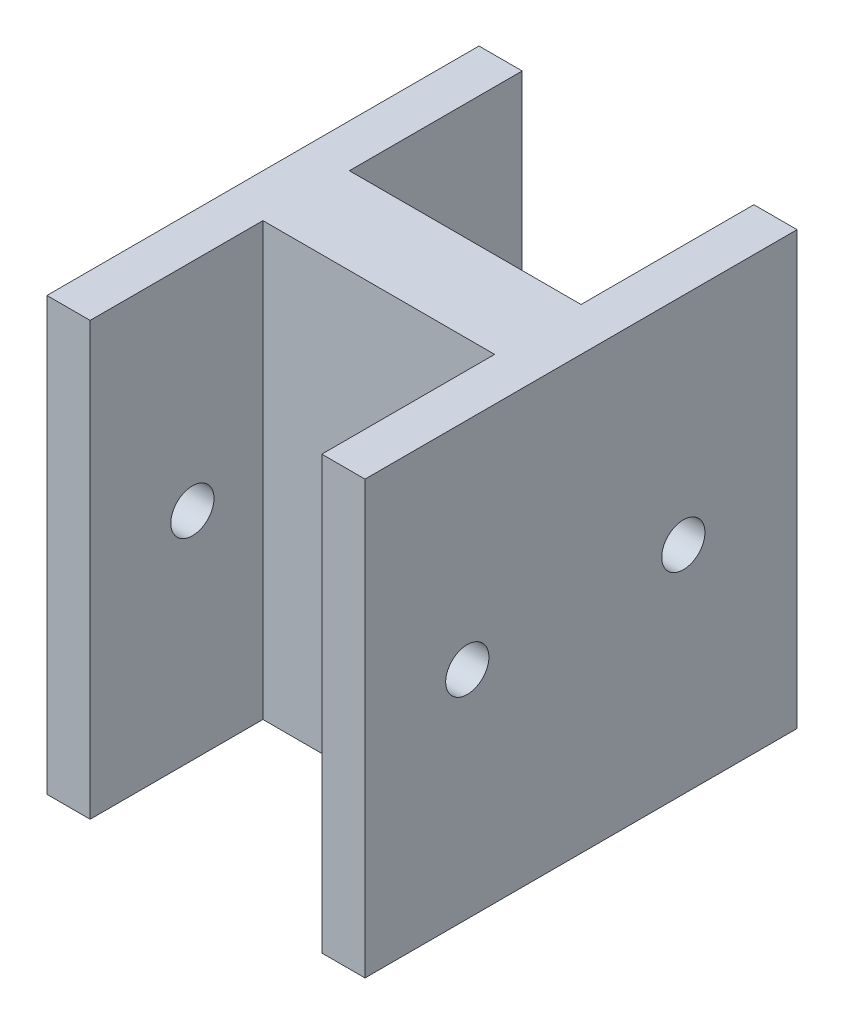
ISO-10303-21;
HEADER;
FILE_DESCRIPTION(('STEP AP214'),'2;1');
FILE_NAME('part.step','',(''),(''),'','','');
FILE_SCHEMA(('AUTOMOTIVE_DESIGN { 1 0 10303 214 1 1 1 1 }'));
ENDSEC;
DATA;
#1=APPLICATION_CONTEXT('core data for automotive mechanical design processes');
#2=APPLICATION_PROTOCOL_DEFINITION('international standard','automotive_design',2000,#1);
#3=PRODUCT_CONTEXT('',#1,'mechanical');
#4=PRODUCT('Part','Part','',(#3));
#5=PRODUCT_RELATED_PRODUCT_CATEGORY('part','',(#4));
#6=PRODUCT_DEFINITION_FORMATION('','',#4);
#7=PRODUCT_DEFINITION_CONTEXT('part definition',#1,'design');
#8=PRODUCT_DEFINITION('design','',#6,#7);
#9=PRODUCT_DEFINITION_SHAPE('','',#8);
#10=(LENGTH_UNIT() NAMED_UNIT(*) SI_UNIT(.MILLI.,.METRE.));
#11=(NAMED_UNIT(*) PLANE_ANGLE_UNIT() SI_UNIT($,.RADIAN.));
#12=(NAMED_UNIT(*) SI_UNIT($,.STERADIAN.) SOLID_ANGLE_UNIT());
#13=UNCERTAINTY_MEASURE_WITH_UNIT(LENGTH_MEASURE(1.E-05),#10,'distance_accuracy_value','');
#14=(GEOMETRIC_REPRESENTATION_CONTEXT(3) GLOBAL_UNCERTAINTY_ASSIGNED_CONTEXT((#13)) GLOBAL_UNIT_ASSIGNED_CONTEXT((#10,
#11,#12)) REPRESENTATION_CONTEXT('',''));
#15=CARTESIAN_POINT('',(0.,0.,0.));
#16=DIRECTION('',(0.,0.,1.));
#17=DIRECTION('',(1.,0.,0.));
#18=AXIS2_PLACEMENT_3D('',#15,#16,#17);
#19=CARTESIAN_POINT('',(-11.3188405797101,10.,-7.6328502415459));
#20=DIRECTION('',(0.,0.,1.));
#21=DIRECTION('',(1.,0.,0.));
#22=AXIS2_PLACEMENT_3D('',#19,#20,#21);
#23=PLANE('',#22);
#24=DIRECTION('',(-1.,0.,0.));
#25=VECTOR('',#24,1.);
#26=CARTESIAN_POINT('',(-11.3188405797101,0.,-7.6328502415459));
#27=LINE('',#26,#25);
#28=CARTESIAN_POINT('',(-11.3188405797101,0.,-7.6328502415459));
#29=VERTEX_POINT('',#28);
#30=CARTESIAN_POINT('',(-12.3188405797101,0.,-7.6328502415459));
#31=VERTEX_POINT('',#30);
#32=EDGE_CURVE('E165',#29,#31,#27,.T.);
#33=ORIENTED_EDGE('',*,*,#32,.T.);
#34=DIRECTION('',(0.,-1.,0.));
#35=VECTOR('',#34,1.);
#36=CARTESIAN_POINT('',(-12.3188405797101,10.,-7.6328502415459));
#37=LINE('',#36,#35);
#38=CARTESIAN_POINT('',(-12.3188405797101,10.,-7.6328502415459));
#39=VERTEX_POINT('',#38);
#40=EDGE_CURVE('E11',#39,#31,#37,.T.);
#41=ORIENTED_EDGE('',*,*,#40,.F.);
#42=DIRECTION('',(-1.,0.,0.));
#43=VECTOR('',#42,1.);
#44=CARTESIAN_POINT('',(-11.3188405797101,10.,-7.6328502415459));
#45=LINE('',#44,#43);
#46=CARTESIAN_POINT('',(-11.3188405797101,10.,-7.6328502415459));
#47=VERTEX_POINT('',#46);
#48=EDGE_CURVE('E200',#47,#39,#45,.T.);
#49=ORIENTED_EDGE('',*,*,#48,.F.);
#50=DIRECTION('',(0.,-1.,0.));
#51=VECTOR('',#50,1.);
#52=CARTESIAN_POINT('',(-11.3188405797101,10.,-7.6328502415459));
#53=LINE('',#52,#51);
#54=EDGE_CURVE('E161',#47,#29,#53,.T.);
#55=ORIENTED_EDGE('',*,*,#54,.T.);
#56=EDGE_LOOP('',(#33,#41,#49,#55));
#57=FACE_BOUND('',#56,.T.);
#58=ADVANCED_FACE('F39',(#57),#23,.F.);
#59=CARTESIAN_POINT('',(-12.3188405797101,10.,-7.6328502415459));
#60=DIRECTION('',(1.,0.,0.));
#61=DIRECTION('',(0.,0.,-1.));
#62=AXIS2_PLACEMENT_3D('',#59,#60,#61);
#63=PLANE('',#62);
#64=CARTESIAN_POINT('',(-12.3188405797101,5.,-5.));
#65=DIRECTION('',(1.,0.,0.));
#66=DIRECTION('',(0.,0.,-1.));
#67=AXIS2_PLACEMENT_3D('',#64,#65,#66);
#68=CIRCLE('',#67,0.5);
#69=CARTESIAN_POINT('',(-12.3188405797101,5.,-5.5));
#70=VERTEX_POINT('',#69);
#71=EDGE_CURVE('E343',#70,#70,#68,.T.);
#72=ORIENTED_EDGE('',*,*,#71,.T.);
#73=EDGE_LOOP('',(#72));
#74=FACE_BOUND('',#73,.T.);
#75=CARTESIAN_POINT('',(-12.3188405797101,5.,0.));
#76=DIRECTION('',(1.,0.,0.));
#77=DIRECTION('',(0.,0.,-1.));
#78=AXIS2_PLACEMENT_3D('',#75,#76,#77);
#79=CIRCLE('',#78,0.5);
#80=CARTESIAN_POINT('',(-12.3188405797101,5.,-0.5));
#81=VERTEX_POINT('',#80);
#82=EDGE_CURVE('E341',#81,#81,#79,.T.);
#83=ORIENTED_EDGE('',*,*,#82,.T.);
#84=EDGE_LOOP('',(#83));
#85=FACE_BOUND('',#84,.T.);
#86=DIRECTION('',(0.,0.,1.));
#87=VECTOR('',#86,1.);
#88=CARTESIAN_POINT('',(-12.3188405797101,0.,-7.6328502415459));
#89=LINE('',#88,#87);
#90=CARTESIAN_POINT('',(-12.3188405797101,0.,2.3671497584541));
#91=VERTEX_POINT('',#90);
#92=EDGE_CURVE('E169',#31,#91,#89,.T.);
#93=ORIENTED_EDGE('',*,*,#92,.T.);
#94=DIRECTION('',(0.,-1.,0.));
#95=VECTOR('',#94,1.);
#96=CARTESIAN_POINT('',(-12.3188405797101,10.,2.3671497584541));
#97=LINE('',#96,#95);
#98=CARTESIAN_POINT('',(-12.3188405797101,10.,2.3671497584541));
#99=VERTEX_POINT('',#98);
#100=EDGE_CURVE('E49',#99,#91,#97,.T.);
#101=ORIENTED_EDGE('',*,*,#100,.F.);
#102=DIRECTION('',(0.,0.,1.));
#103=VECTOR('',#102,1.);
#104=CARTESIAN_POINT('',(-12.3188405797101,10.,-7.6328502415459));
#105=LINE('',#104,#103);
#106=EDGE_CURVE('E112',#39,#99,#105,.T.);
#107=ORIENTED_EDGE('',*,*,#106,.F.);
#108=ORIENTED_EDGE('',*,*,#40,.T.);
#109=EDGE_LOOP('',(#93,#101,#107,#108));
#110=FACE_BOUND('',#109,.T.);
#111=ADVANCED_FACE('F297',(#74,#85,#110),#63,.F.);
#112=CARTESIAN_POINT('',(-12.3188405797101,10.,2.3671497584541));
#113=DIRECTION('',(0.,0.,-1.));
#114=DIRECTION('',(-1.,0.,0.));
#115=AXIS2_PLACEMENT_3D('',#112,#113,#114);
#116=PLANE('',#115);
#117=DIRECTION('',(1.,0.,0.));
#118=VECTOR('',#117,1.);
#119=CARTESIAN_POINT('',(-12.3188405797101,0.,2.3671497584541));
#120=LINE('',#119,#118);
#121=CARTESIAN_POINT('',(-11.3188405797101,0.,2.3671497584541));
#122=VERTEX_POINT('',#121);
#123=EDGE_CURVE('E173',#91,#122,#120,.T.);
#124=ORIENTED_EDGE('',*,*,#123,.T.);
#125=DIRECTION('',(0.,-1.,0.));
#126=VECTOR('',#125,1.);
#127=CARTESIAN_POINT('',(-11.3188405797101,10.,2.3671497584541));
#128=LINE('',#127,#126);
#129=CARTESIAN_POINT('',(-11.3188405797101,10.,2.3671497584541));
#130=VERTEX_POINT('',#129);
#131=EDGE_CURVE('E227',#130,#122,#128,.T.);
#132=ORIENTED_EDGE('',*,*,#131,.F.);
#133=DIRECTION('',(1.,0.,0.));
#134=VECTOR('',#133,1.);
#135=CARTESIAN_POINT('',(-12.3188405797101,10.,2.3671497584541));
#136=LINE('',#135,#134);
#137=EDGE_CURVE('E238',#99,#130,#136,.T.);
#138=ORIENTED_EDGE('',*,*,#137,.F.);
#139=ORIENTED_EDGE('',*,*,#100,.T.);
#140=EDGE_LOOP('',(#124,#132,#138,#139));
#141=FACE_BOUND('',#140,.T.);
#142=ADVANCED_FACE('F236',(#141),#116,.F.);
#143=CARTESIAN_POINT('',(-11.3188405797101,10.,2.3671497584541));
#144=DIRECTION('',(-1.,0.,0.));
#145=DIRECTION('',(0.,0.,1.));
#146=AXIS2_PLACEMENT_3D('',#143,#144,#145);
#147=PLANE('',#146);
#148=CARTESIAN_POINT('',(-11.3188405797101,5.,0.));
#149=DIRECTION('',(-1.,0.,0.));
#150=DIRECTION('',(0.,0.,1.));
#151=AXIS2_PLACEMENT_3D('',#148,#149,#150);
#152=CIRCLE('',#151,0.5);
#153=CARTESIAN_POINT('',(-11.3188405797101,5.,0.5));
#154=VERTEX_POINT('',#153);
#155=EDGE_CURVE('E170',#154,#154,#152,.T.);
#156=ORIENTED_EDGE('',*,*,#155,.T.);
#157=EDGE_LOOP('',(#156));
#158=FACE_BOUND('',#157,.T.);
#159=DIRECTION('',(0.,0.,-1.));
#160=VECTOR('',#159,1.);
#161=CARTESIAN_POINT('',(-11.3188405797101,0.,2.3671497584541));
#162=LINE('',#161,#160);
#163=CARTESIAN_POINT('',(-11.3188405797101,0.,-1.6328502415459));
#164=VERTEX_POINT('',#163);
#165=EDGE_CURVE('E176',#122,#164,#162,.T.);
#166=ORIENTED_EDGE('',*,*,#165,.T.);
#167=DIRECTION('',(0.,-1.,0.));
#168=VECTOR('',#167,1.);
#169=CARTESIAN_POINT('',(-11.3188405797101,10.,-1.6328502415459));
#170=LINE('',#169,#168);
#171=CARTESIAN_POINT('',(-11.3188405797101,10.,-1.6328502415459));
#172=VERTEX_POINT('',#171);
#173=EDGE_CURVE('E223',#172,#164,#170,.T.);
#174=ORIENTED_EDGE('',*,*,#173,.F.);
#175=DIRECTION('',(0.,0.,-1.));
#176=VECTOR('',#175,1.);
#177=CARTESIAN_POINT('',(-11.3188405797101,10.,2.3671497584541));
#178=LINE('',#177,#176);
#179=EDGE_CURVE('E257',#130,#172,#178,.T.);
#180=ORIENTED_EDGE('',*,*,#179,.F.);
#181=ORIENTED_EDGE('',*,*,#131,.T.);
#182=EDGE_LOOP('',(#166,#174,#180,#181));
#183=FACE_BOUND('',#182,.T.);
#184=ADVANCED_FACE('F247',(#158,#183),#147,.F.);
#185=CARTESIAN_POINT('',(-11.3188405797101,10.,-1.6328502415459));
#186=DIRECTION('',(0.,0.,-1.));
#187=DIRECTION('',(-1.,0.,0.));
#188=AXIS2_PLACEMENT_3D('',#185,#186,#187);
#189=PLANE('',#188);
#190=DIRECTION('',(1.,0.,0.));
#191=VECTOR('',#190,1.);
#192=CARTESIAN_POINT('',(-11.3188405797101,0.,-1.6328502415459));
#193=LINE('',#192,#191);
#194=CARTESIAN_POINT('',(-5.95652173913044,0.,-1.6328502415459));
#195=VERTEX_POINT('',#194);
#196=EDGE_CURVE('E179',#164,#195,#193,.T.);
#197=ORIENTED_EDGE('',*,*,#196,.T.);
#198=DIRECTION('',(0.,-1.,0.));
#199=VECTOR('',#198,1.);
#200=CARTESIAN_POINT('',(-5.95652173913044,10.,-1.6328502415459));
#201=LINE('',#200,#199);
#202=CARTESIAN_POINT('',(-5.95652173913044,10.,-1.6328502415459));
#203=VERTEX_POINT('',#202);
#204=EDGE_CURVE('E219',#203,#195,#201,.T.);
#205=ORIENTED_EDGE('',*,*,#204,.F.);
#206=DIRECTION('',(1.,0.,0.));
#207=VECTOR('',#206,1.);
#208=CARTESIAN_POINT('',(-11.3188405797101,10.,-1.6328502415459));
#209=LINE('',#208,#207);
#210=EDGE_CURVE('E253',#172,#203,#209,.T.);
#211=ORIENTED_EDGE('',*,*,#210,.F.);
#212=ORIENTED_EDGE('',*,*,#173,.T.);
#213=EDGE_LOOP('',(#197,#205,#211,#212));
#214=FACE_BOUND('',#213,.T.);
#215=ADVANCED_FACE('F251',(#214),#189,.F.);
#216=CARTESIAN_POINT('',(-5.95652173913044,10.,-1.6328502415459));
#217=DIRECTION('',(1.,0.,0.));
#218=DIRECTION('',(0.,0.,-1.));
#219=AXIS2_PLACEMENT_3D('',#216,#217,#218);
#220=PLANE('',#219);
#221=CARTESIAN_POINT('',(-5.95652173913043,5.,0.));
#222=DIRECTION('',(1.,0.,0.));
#223=DIRECTION('',(0.,0.,-1.));
#224=AXIS2_PLACEMENT_3D('',#221,#222,#223);
#225=CIRCLE('',#224,0.5);
#226=CARTESIAN_POINT('',(-5.95652173913043,5.,-0.5));
#227=VERTEX_POINT('',#226);
#228=EDGE_CURVE('E350',#227,#227,#225,.T.);
#229=ORIENTED_EDGE('',*,*,#228,.T.);
#230=EDGE_LOOP('',(#229));
#231=FACE_BOUND('',#230,.T.);
#232=DIRECTION('',(0.,0.,1.));
#233=VECTOR('',#232,1.);
#234=CARTESIAN_POINT('',(-5.95652173913044,0.,-1.6328502415459));
#235=LINE('',#234,#233);
#236=CARTESIAN_POINT('',(-5.95652173913043,0.,2.3671497584541));
#237=VERTEX_POINT('',#236);
#238=EDGE_CURVE('E182',#195,#237,#235,.T.);
#239=ORIENTED_EDGE('',*,*,#238,.T.);
#240=DIRECTION('',(0.,-1.,0.));
#241=VECTOR('',#240,1.);
#242=CARTESIAN_POINT('',(-5.95652173913043,10.,2.3671497584541));
#243=LINE('',#242,#241);
#244=CARTESIAN_POINT('',(-5.95652173913043,10.,2.3671497584541));
#245=VERTEX_POINT('',#244);
#246=EDGE_CURVE('E215',#245,#237,#243,.T.);
#247=ORIENTED_EDGE('',*,*,#246,.F.);
#248=DIRECTION('',(0.,0.,1.));
#249=VECTOR('',#248,1.);
#250=CARTESIAN_POINT('',(-5.95652173913044,10.,-1.6328502415459));
#251=LINE('',#250,#249);
#252=EDGE_CURVE('E256',#203,#245,#251,.T.);
#253=ORIENTED_EDGE('',*,*,#252,.F.);
#254=ORIENTED_EDGE('',*,*,#204,.T.);
#255=EDGE_LOOP('',(#239,#247,#253,#254));
#256=FACE_BOUND('',#255,.T.);
#257=ADVANCED_FACE('F314',(#231,#256),#220,.F.);
#258=CARTESIAN_POINT('',(-5.95652173913043,10.,2.3671497584541));
#259=DIRECTION('',(0.,0.,-1.));
#260=DIRECTION('',(-1.,0.,0.));
#261=AXIS2_PLACEMENT_3D('',#258,#259,#260);
#262=PLANE('',#261);
#263=DIRECTION('',(1.,0.,0.));
#264=VECTOR('',#263,1.);
#265=CARTESIAN_POINT('',(-5.95652173913043,0.,2.3671497584541));
#266=LINE('',#265,#264);
#267=CARTESIAN_POINT('',(-4.95652173913043,0.,2.3671497584541));
#268=VERTEX_POINT('',#267);
#269=EDGE_CURVE('E185',#237,#268,#266,.T.);
#270=ORIENTED_EDGE('',*,*,#269,.T.);
#271=DIRECTION('',(0.,-1.,0.));
#272=VECTOR('',#271,1.);
#273=CARTESIAN_POINT('',(-4.95652173913043,10.,2.3671497584541));
#274=LINE('',#273,#272);
#275=CARTESIAN_POINT('',(-4.95652173913043,10.,2.3671497584541));
#276=VERTEX_POINT('',#275);
#277=EDGE_CURVE('E211',#276,#268,#274,.T.);
#278=ORIENTED_EDGE('',*,*,#277,.F.);
#279=DIRECTION('',(1.,0.,0.));
#280=VECTOR('',#279,1.);
#281=CARTESIAN_POINT('',(-5.95652173913043,10.,2.3671497584541));
#282=LINE('',#281,#280);
#283=EDGE_CURVE('E261',#245,#276,#282,.T.);
#284=ORIENTED_EDGE('',*,*,#283,.F.);
#285=ORIENTED_EDGE('',*,*,#246,.T.);
#286=EDGE_LOOP('',(#270,#278,#284,#285));
#287=FACE_BOUND('',#286,.T.);
#288=ADVANCED_FACE('F317',(#287),#262,.F.);
#289=CARTESIAN_POINT('',(-4.95652173913043,10.,2.3671497584541));
#290=DIRECTION('',(-1.,0.,0.));
#291=DIRECTION('',(0.,0.,1.));
#292=AXIS2_PLACEMENT_3D('',#289,#290,#291);
#293=PLANE('',#292);
#294=CARTESIAN_POINT('',(-4.95652173913043,5.,-5.));
#295=DIRECTION('',(1.,0.,0.));
#296=DIRECTION('',(0.,0.,-1.));
#297=AXIS2_PLACEMENT_3D('',#294,#295,#296);
#298=CIRCLE('',#297,0.5);
#299=CARTESIAN_POINT('',(-4.95652173913043,5.,-5.5));
#300=VERTEX_POINT('',#299);
#301=EDGE_CURVE('E346',#300,#300,#298,.T.);
#302=ORIENTED_EDGE('',*,*,#301,.F.);
#303=EDGE_LOOP('',(#302));
#304=FACE_BOUND('',#303,.T.);
#305=CARTESIAN_POINT('',(-4.95652173913043,5.,0.));
#306=DIRECTION('',(1.,0.,0.));
#307=DIRECTION('',(0.,0.,-1.));
#308=AXIS2_PLACEMENT_3D('',#305,#306,#307);
#309=CIRCLE('',#308,0.5);
#310=CARTESIAN_POINT('',(-4.95652173913043,5.,-0.5));
#311=VERTEX_POINT('',#310);
#312=EDGE_CURVE('E336',#311,#311,#309,.T.);
#313=ORIENTED_EDGE('',*,*,#312,.F.);
#314=EDGE_LOOP('',(#313));
#315=FACE_BOUND('',#314,.T.);
#316=DIRECTION('',(0.,0.,-1.));
#317=VECTOR('',#316,1.);
#318=CARTESIAN_POINT('',(-4.95652173913043,0.,2.3671497584541));
#319=LINE('',#318,#317);
#320=CARTESIAN_POINT('',(-4.95652173913043,0.,-7.6328502415459));
#321=VERTEX_POINT('',#320);
#322=EDGE_CURVE('E188',#268,#321,#319,.T.);
#323=ORIENTED_EDGE('',*,*,#322,.T.);
#324=DIRECTION('',(0.,-1.,0.));
#325=VECTOR('',#324,1.);
#326=CARTESIAN_POINT('',(-4.95652173913043,10.,-7.6328502415459));
#327=LINE('',#326,#325);
#328=CARTESIAN_POINT('',(-4.95652173913043,10.,-7.6328502415459));
#329=VERTEX_POINT('',#328);
#330=EDGE_CURVE('E207',#329,#321,#327,.T.);
#331=ORIENTED_EDGE('',*,*,#330,.F.);
#332=DIRECTION('',(0.,0.,-1.));
#333=VECTOR('',#332,1.);
#334=CARTESIAN_POINT('',(-4.95652173913043,10.,2.3671497584541));
#335=LINE('',#334,#333);
#336=EDGE_CURVE('E268',#276,#329,#335,.T.);
#337=ORIENTED_EDGE('',*,*,#336,.F.);
#338=ORIENTED_EDGE('',*,*,#277,.T.);
#339=EDGE_LOOP('',(#323,#331,#337,#338));
#340=FACE_BOUND('',#339,.T.);
#341=ADVANCED_FACE('F276',(#304,#315,#340),#293,.F.);
#342=CARTESIAN_POINT('',(-4.95652173913043,10.,-7.6328502415459));
#343=DIRECTION('',(0.,0.,1.));
#344=DIRECTION('',(1.,0.,0.));
#345=AXIS2_PLACEMENT_3D('',#342,#343,#344);
#346=PLANE('',#345);
#347=DIRECTION('',(-1.,0.,0.));
#348=VECTOR('',#347,1.);
#349=CARTESIAN_POINT('',(-4.95652173913043,0.,-7.6328502415459));
#350=LINE('',#349,#348);
#351=CARTESIAN_POINT('',(-5.95652173913044,0.,-7.6328502415459));
#352=VERTEX_POINT('',#351);
#353=EDGE_CURVE('E191',#321,#352,#350,.T.);
#354=ORIENTED_EDGE('',*,*,#353,.T.);
#355=DIRECTION('',(0.,-1.,0.));
#356=VECTOR('',#355,1.);
#357=CARTESIAN_POINT('',(-5.95652173913044,10.,-7.6328502415459));
#358=LINE('',#357,#356);
#359=CARTESIAN_POINT('',(-5.95652173913044,10.,-7.6328502415459));
#360=VERTEX_POINT('',#359);
#361=EDGE_CURVE('E154',#360,#352,#358,.T.);
#362=ORIENTED_EDGE('',*,*,#361,.F.);
#363=DIRECTION('',(-1.,0.,0.));
#364=VECTOR('',#363,1.);
#365=CARTESIAN_POINT('',(-4.95652173913043,10.,-7.6328502415459));
#366=LINE('',#365,#364);
#367=EDGE_CURVE('E143',#329,#360,#366,.T.);
#368=ORIENTED_EDGE('',*,*,#367,.F.);
#369=ORIENTED_EDGE('',*,*,#330,.T.);
#370=EDGE_LOOP('',(#354,#362,#368,#369));
#371=FACE_BOUND('',#370,.T.);
#372=ADVANCED_FACE('F280',(#371),#346,.F.);
#373=CARTESIAN_POINT('',(-5.95652173913044,10.,-7.6328502415459));
#374=DIRECTION('',(1.,0.,0.));
#375=DIRECTION('',(0.,0.,-1.));
#376=AXIS2_PLACEMENT_3D('',#373,#374,#375);
#377=PLANE('',#376);
#378=CARTESIAN_POINT('',(-5.95652173913043,5.,-5.));
#379=DIRECTION('',(1.,0.,0.));
#380=DIRECTION('',(0.,0.,-1.));
#381=AXIS2_PLACEMENT_3D('',#378,#379,#380);
#382=CIRCLE('',#381,0.5);
#383=CARTESIAN_POINT('',(-5.95652173913043,5.,-5.5));
#384=VERTEX_POINT('',#383);
#385=EDGE_CURVE('E333',#384,#384,#382,.T.);
#386=ORIENTED_EDGE('',*,*,#385,.T.);
#387=EDGE_LOOP('',(#386));
#388=FACE_BOUND('',#387,.T.);
#389=DIRECTION('',(0.,0.,1.));
#390=VECTOR('',#389,1.);
#391=CARTESIAN_POINT('',(-5.95652173913044,0.,-7.6328502415459));
#392=LINE('',#391,#390);
#393=CARTESIAN_POINT('',(-5.95652173913043,0.,-3.6328502415459));
#394=VERTEX_POINT('',#393);
#395=EDGE_CURVE('E152',#352,#394,#392,.T.);
#396=ORIENTED_EDGE('',*,*,#395,.T.);
#397=DIRECTION('',(0.,-1.,0.));
#398=VECTOR('',#397,1.);
#399=CARTESIAN_POINT('',(-5.95652173913043,10.,-3.6328502415459));
#400=LINE('',#399,#398);
#401=CARTESIAN_POINT('',(-5.95652173913043,10.,-3.6328502415459));
#402=VERTEX_POINT('',#401);
#403=EDGE_CURVE('E149',#402,#394,#400,.T.);
#404=ORIENTED_EDGE('',*,*,#403,.F.);
#405=DIRECTION('',(0.,0.,1.));
#406=VECTOR('',#405,1.);
#407=CARTESIAN_POINT('',(-5.95652173913044,10.,-7.6328502415459));
#408=LINE('',#407,#406);
#409=EDGE_CURVE('E137',#360,#402,#408,.T.);
#410=ORIENTED_EDGE('',*,*,#409,.F.);
#411=ORIENTED_EDGE('',*,*,#361,.T.);
#412=EDGE_LOOP('',(#396,#404,#410,#411));
#413=FACE_BOUND('',#412,.T.);
#414=ADVANCED_FACE('F150',(#388,#413),#377,.F.);
#415=CARTESIAN_POINT('',(-5.95652173913043,10.,-3.6328502415459));
#416=DIRECTION('',(0.,0.,1.));
#417=DIRECTION('',(1.,0.,0.));
#418=AXIS2_PLACEMENT_3D('',#415,#416,#417);
#419=PLANE('',#418);
#420=DIRECTION('',(-1.,0.,0.));
#421=VECTOR('',#420,1.);
#422=CARTESIAN_POINT('',(-5.95652173913043,0.,-3.6328502415459));
#423=LINE('',#422,#421);
#424=CARTESIAN_POINT('',(-11.3188405797101,0.,-3.6328502415459));
#425=VERTEX_POINT('',#424);
#426=EDGE_CURVE('E98',#394,#425,#423,.T.);
#427=ORIENTED_EDGE('',*,*,#426,.T.);
#428=DIRECTION('',(0.,-1.,0.));
#429=VECTOR('',#428,1.);
#430=CARTESIAN_POINT('',(-11.3188405797101,10.,-3.6328502415459));
#431=LINE('',#430,#429);
#432=CARTESIAN_POINT('',(-11.3188405797101,10.,-3.6328502415459));
#433=VERTEX_POINT('',#432);
#434=EDGE_CURVE('E155',#433,#425,#431,.T.);
#435=ORIENTED_EDGE('',*,*,#434,.F.);
#436=DIRECTION('',(-1.,0.,0.));
#437=VECTOR('',#436,1.);
#438=CARTESIAN_POINT('',(-5.95652173913043,10.,-3.6328502415459));
#439=LINE('',#438,#437);
#440=EDGE_CURVE('E141',#402,#433,#439,.T.);
#441=ORIENTED_EDGE('',*,*,#440,.F.);
#442=ORIENTED_EDGE('',*,*,#403,.T.);
#443=EDGE_LOOP('',(#427,#435,#441,#442));
#444=FACE_BOUND('',#443,.T.);
#445=ADVANCED_FACE('F157',(#444),#419,.F.);
#446=CARTESIAN_POINT('',(-11.3188405797101,10.,-3.6328502415459));
#447=DIRECTION('',(-1.,0.,0.));
#448=DIRECTION('',(0.,0.,1.));
#449=AXIS2_PLACEMENT_3D('',#446,#447,#448);
#450=PLANE('',#449);
#451=CARTESIAN_POINT('',(-11.3188405797101,5.,-5.));
#452=DIRECTION('',(-1.,0.,0.));
#453=DIRECTION('',(0.,0.,1.));
#454=AXIS2_PLACEMENT_3D('',#451,#452,#453);
#455=CIRCLE('',#454,0.5);
#456=CARTESIAN_POINT('',(-11.3188405797101,5.,-4.5));
#457=VERTEX_POINT('',#456);
#458=EDGE_CURVE('E42',#457,#457,#455,.T.);
#459=ORIENTED_EDGE('',*,*,#458,.T.);
#460=EDGE_LOOP('',(#459));
#461=FACE_BOUND('',#460,.T.);
#462=DIRECTION('',(0.,0.,-1.));
#463=VECTOR('',#462,1.);
#464=CARTESIAN_POINT('',(-11.3188405797101,0.,-3.6328502415459));
#465=LINE('',#464,#463);
#466=EDGE_CURVE('E104',#425,#29,#465,.T.);
#467=ORIENTED_EDGE('',*,*,#466,.T.);
#468=ORIENTED_EDGE('',*,*,#54,.F.);
#469=DIRECTION('',(0.,0.,-1.));
#470=VECTOR('',#469,1.);
#471=CARTESIAN_POINT('',(-11.3188405797101,10.,-3.6328502415459));
#472=LINE('',#471,#470);
#473=EDGE_CURVE('E57',#433,#47,#472,.T.);
#474=ORIENTED_EDGE('',*,*,#473,.F.);
#475=ORIENTED_EDGE('',*,*,#434,.T.);
#476=EDGE_LOOP('',(#467,#468,#474,#475));
#477=FACE_BOUND('',#476,.T.);
#478=ADVANCED_FACE('F284',(#461,#477),#450,.F.);
#479=CARTESIAN_POINT('',(0.,10.,0.));
#480=DIRECTION('',(0.,1.,0.));
#481=DIRECTION('',(0.,0.,1.));
#482=AXIS2_PLACEMENT_3D('',#479,#480,#481);
#483=PLANE('',#482);
#484=ORIENTED_EDGE('',*,*,#48,.T.);
#485=ORIENTED_EDGE('',*,*,#106,.T.);
#486=ORIENTED_EDGE('',*,*,#137,.T.);
#487=ORIENTED_EDGE('',*,*,#179,.T.);
#488=ORIENTED_EDGE('',*,*,#210,.T.);
#489=ORIENTED_EDGE('',*,*,#252,.T.);
#490=ORIENTED_EDGE('',*,*,#283,.T.);
#491=ORIENTED_EDGE('',*,*,#336,.T.);
#492=ORIENTED_EDGE('',*,*,#367,.T.);
#493=ORIENTED_EDGE('',*,*,#409,.T.);
#494=ORIENTED_EDGE('',*,*,#440,.T.);
#495=ORIENTED_EDGE('',*,*,#473,.T.);
#496=EDGE_LOOP('',(#484,#485,#486,#487,#488,#489,#490,#491,#492,#493,#494,#495));
#497=FACE_BOUND('',#496,.T.);
#498=ADVANCED_FACE('F139',(#497),#483,.T.);
#499=CARTESIAN_POINT('',(0.,0.,0.));
#500=DIRECTION('',(0.,1.,0.));
#501=DIRECTION('',(0.,0.,1.));
#502=AXIS2_PLACEMENT_3D('',#499,#500,#501);
#503=PLANE('',#502);
#504=ORIENTED_EDGE('',*,*,#32,.F.);
#505=ORIENTED_EDGE('',*,*,#466,.F.);
#506=ORIENTED_EDGE('',*,*,#426,.F.);
#507=ORIENTED_EDGE('',*,*,#395,.F.);
#508=ORIENTED_EDGE('',*,*,#353,.F.);
#509=ORIENTED_EDGE('',*,*,#322,.F.);
#510=ORIENTED_EDGE('',*,*,#269,.F.);
#511=ORIENTED_EDGE('',*,*,#238,.F.);
#512=ORIENTED_EDGE('',*,*,#196,.F.);
#513=ORIENTED_EDGE('',*,*,#165,.F.);
#514=ORIENTED_EDGE('',*,*,#123,.F.);
#515=ORIENTED_EDGE('',*,*,#92,.F.);
#516=EDGE_LOOP('',(#504,#505,#506,#507,#508,#509,#510,#511,#512,#513,#514,#515));
#517=FACE_BOUND('',#516,.T.);
#518=ADVANCED_FACE('F242',(#517),#503,.F.);
#519=CARTESIAN_POINT('',(-12.3188405797101,5.,0.));
#520=DIRECTION('',(1.,0.,0.));
#521=DIRECTION('',(0.,0.,-1.));
#522=AXIS2_PLACEMENT_3D('',#519,#520,#521);
#523=CYLINDRICAL_SURFACE('',#522,0.5);
#524=ORIENTED_EDGE('',*,*,#312,.T.);
#525=EDGE_LOOP('',(#524));
#526=FACE_BOUND('',#525,.T.);
#527=ORIENTED_EDGE('',*,*,#228,.F.);
#528=EDGE_LOOP('',(#527));
#529=FACE_BOUND('',#528,.T.);
#530=ADVANCED_FACE('F367',(#526,#529),#523,.F.);
#531=ORIENTED_EDGE('',*,*,#82,.F.);
#532=EDGE_LOOP('',(#531));
#533=FACE_BOUND('',#532,.T.);
#534=ORIENTED_EDGE('',*,*,#155,.F.);
#535=EDGE_LOOP('',(#534));
#536=FACE_BOUND('',#535,.T.);
#537=ADVANCED_FACE('F364',(#533,#536),#523,.F.);
#538=CARTESIAN_POINT('',(-12.3188405797101,5.,-5.));
#539=DIRECTION('',(1.,0.,0.));
#540=DIRECTION('',(0.,0.,-1.));
#541=AXIS2_PLACEMENT_3D('',#538,#539,#540);
#542=CYLINDRICAL_SURFACE('',#541,0.5);
#543=ORIENTED_EDGE('',*,*,#71,.F.);
#544=EDGE_LOOP('',(#543));
#545=FACE_BOUND('',#544,.T.);
#546=ORIENTED_EDGE('',*,*,#458,.F.);
#547=EDGE_LOOP('',(#546));
#548=FACE_BOUND('',#547,.T.);
#549=ADVANCED_FACE('F366',(#545,#548),#542,.F.);
#550=ORIENTED_EDGE('',*,*,#301,.T.);
#551=EDGE_LOOP('',(#550));
#552=FACE_BOUND('',#551,.T.);
#553=ORIENTED_EDGE('',*,*,#385,.F.);
#554=EDGE_LOOP('',(#553));
#555=FACE_BOUND('',#554,.T.);
#556=ADVANCED_FACE('F374',(#552,#555),#542,.F.);
#557=CLOSED_SHELL('',(#58,#111,#142,#184,#215,#257,#288,#341,#372,#414,#445,#478,#498,#518,#530,
#537,#549,#556));
#558=MANIFOLD_SOLID_BREP('B2',#557);
#559=ADVANCED_BREP_SHAPE_REPRESENTATION('',(#18,#558),#14);
#560=SHAPE_DEFINITION_REPRESENTATION(#9,#559);
ENDSEC;
END-ISO-10303-21;
